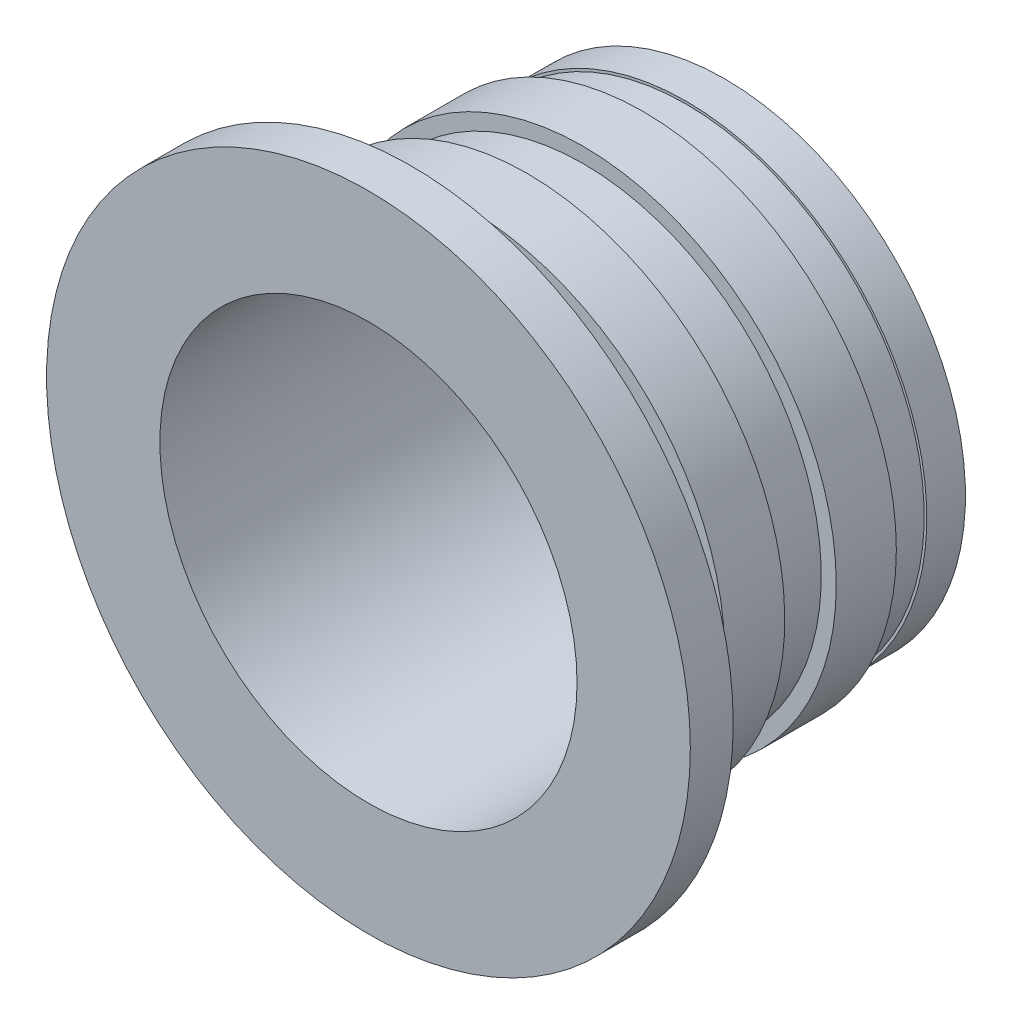
ISO-10303-21;
HEADER;
FILE_DESCRIPTION(('STEP AP214'),'2;1');
FILE_NAME('part.step','',(''),(''),'','','');
FILE_SCHEMA(('AUTOMOTIVE_DESIGN { 1 0 10303 214 1 1 1 1 }'));
ENDSEC;
DATA;
#1=APPLICATION_CONTEXT('core data for automotive mechanical design processes');
#2=APPLICATION_PROTOCOL_DEFINITION('international standard','automotive_design',2000,#1);
#3=PRODUCT_CONTEXT('',#1,'mechanical');
#4=PRODUCT('Part','Part','',(#3));
#5=PRODUCT_RELATED_PRODUCT_CATEGORY('part','',(#4));
#6=PRODUCT_DEFINITION_FORMATION('','',#4);
#7=PRODUCT_DEFINITION_CONTEXT('part definition',#1,'design');
#8=PRODUCT_DEFINITION('design','',#6,#7);
#9=PRODUCT_DEFINITION_SHAPE('','',#8);
#10=(LENGTH_UNIT() NAMED_UNIT(*) SI_UNIT(.MILLI.,.METRE.));
#11=(NAMED_UNIT(*) PLANE_ANGLE_UNIT() SI_UNIT($,.RADIAN.));
#12=(NAMED_UNIT(*) SI_UNIT($,.STERADIAN.) SOLID_ANGLE_UNIT());
#13=UNCERTAINTY_MEASURE_WITH_UNIT(LENGTH_MEASURE(1.E-05),#10,'distance_accuracy_value','');
#14=(GEOMETRIC_REPRESENTATION_CONTEXT(3) GLOBAL_UNCERTAINTY_ASSIGNED_CONTEXT((#13)) GLOBAL_UNIT_ASSIGNED_CONTEXT((#10,
#11,#12)) REPRESENTATION_CONTEXT('',''));
#15=CARTESIAN_POINT('',(0.,0.,0.));
#16=DIRECTION('',(0.,0.,1.));
#17=DIRECTION('',(1.,0.,0.));
#18=AXIS2_PLACEMENT_3D('',#15,#16,#17);
#19=CARTESIAN_POINT('',(0.,0.,1.27));
#20=DIRECTION('',(0.,0.,-1.));
#21=DIRECTION('',(-1.,0.,0.));
#22=AXIS2_PLACEMENT_3D('',#19,#20,#21);
#23=CYLINDRICAL_SURFACE('',#22,9.525);
#24=CARTESIAN_POINT('',(0.,0.,1.27));
#25=DIRECTION('',(0.,0.,1.));
#26=DIRECTION('',(1.,0.,0.));
#27=AXIS2_PLACEMENT_3D('',#24,#25,#26);
#28=CIRCLE('',#27,9.525);
#29=CARTESIAN_POINT('',(9.525,0.,1.27));
#30=VERTEX_POINT('',#29);
#31=EDGE_CURVE('E10',#30,#30,#28,.T.);
#32=ORIENTED_EDGE('',*,*,#31,.F.);
#33=EDGE_LOOP('',(#32));
#34=FACE_BOUND('',#33,.T.);
#35=CARTESIAN_POINT('',(0.,0.,0.));
#36=DIRECTION('',(0.,0.,1.));
#37=DIRECTION('',(1.,0.,0.));
#38=AXIS2_PLACEMENT_3D('',#35,#36,#37);
#39=CIRCLE('',#38,9.525);
#40=CARTESIAN_POINT('',(9.525,0.,0.));
#41=VERTEX_POINT('',#40);
#42=EDGE_CURVE('E35',#41,#41,#39,.T.);
#43=ORIENTED_EDGE('',*,*,#42,.T.);
#44=EDGE_LOOP('',(#43));
#45=FACE_BOUND('',#44,.T.);
#46=ADVANCED_FACE('F32',(#34,#45),#23,.T.);
#47=CARTESIAN_POINT('',(0.,0.,1.27));
#48=DIRECTION('',(0.,0.,1.));
#49=DIRECTION('',(1.,0.,0.));
#50=AXIS2_PLACEMENT_3D('',#47,#48,#49);
#51=PLANE('',#50);
#52=CARTESIAN_POINT('',(0.,0.,1.27));
#53=DIRECTION('',(0.,0.,1.));
#54=DIRECTION('',(1.,0.,0.));
#55=AXIS2_PLACEMENT_3D('',#52,#53,#54);
#56=CIRCLE('',#55,6.1722);
#57=CARTESIAN_POINT('',(6.1722,0.,1.27));
#58=VERTEX_POINT('',#57);
#59=EDGE_CURVE('E44',#58,#58,#56,.T.);
#60=ORIENTED_EDGE('',*,*,#59,.F.);
#61=EDGE_LOOP('',(#60));
#62=FACE_BOUND('',#61,.T.);
#63=ORIENTED_EDGE('',*,*,#31,.T.);
#64=EDGE_LOOP('',(#63));
#65=FACE_BOUND('',#64,.T.);
#66=ADVANCED_FACE('F103',(#62,#65),#51,.T.);
#67=CARTESIAN_POINT('',(0.,0.,0.));
#68=DIRECTION('',(0.,0.,1.));
#69=DIRECTION('',(1.,0.,0.));
#70=AXIS2_PLACEMENT_3D('',#67,#68,#69);
#71=PLANE('',#70);
#72=ORIENTED_EDGE('',*,*,#42,.F.);
#73=EDGE_LOOP('',(#72));
#74=FACE_BOUND('',#73,.T.);
#75=CARTESIAN_POINT('',(0.,0.,0.));
#76=DIRECTION('',(0.,0.,-1.));
#77=DIRECTION('',(0.,1.,0.));
#78=AXIS2_PLACEMENT_3D('',#75,#76,#77);
#79=CIRCLE('',#78,7.1247);
#80=CARTESIAN_POINT('',(0.,7.1247,0.));
#81=VERTEX_POINT('',#80);
#82=EDGE_CURVE('E94',#81,#81,#79,.T.);
#83=ORIENTED_EDGE('',*,*,#82,.F.);
#84=EDGE_LOOP('',(#83));
#85=FACE_BOUND('',#84,.T.);
#86=ADVANCED_FACE('F100',(#74,#85),#71,.F.);
#87=CARTESIAN_POINT('',(0.,0.,-9.271));
#88=DIRECTION('',(0.,0.,1.));
#89=DIRECTION('',(1.,0.,0.));
#90=AXIS2_PLACEMENT_3D('',#87,#88,#89);
#91=PLANE('',#90);
#92=CARTESIAN_POINT('',(0.,0.,-9.271));
#93=DIRECTION('',(0.,0.,-1.));
#94=DIRECTION('',(0.,1.,0.));
#95=AXIS2_PLACEMENT_3D('',#92,#93,#94);
#96=CIRCLE('',#95,7.1247);
#97=CARTESIAN_POINT('',(0.,7.1247,-9.271));
#98=VERTEX_POINT('',#97);
#99=EDGE_CURVE('E91',#98,#98,#96,.T.);
#100=ORIENTED_EDGE('',*,*,#99,.T.);
#101=EDGE_LOOP('',(#100));
#102=FACE_BOUND('',#101,.T.);
#103=CARTESIAN_POINT('',(0.,-3.937,-9.271));
#104=DIRECTION('',(0.,0.,1.));
#105=DIRECTION('',(-1.,0.,0.));
#106=AXIS2_PLACEMENT_3D('',#103,#104,#105);
#107=CIRCLE('',#106,1.27);
#108=CARTESIAN_POINT('',(-1.27,-3.937,-9.271));
#109=VERTEX_POINT('',#108);
#110=EDGE_CURVE('E53',#109,#109,#107,.T.);
#111=ORIENTED_EDGE('',*,*,#110,.T.);
#112=EDGE_LOOP('',(#111));
#113=FACE_BOUND('',#112,.T.);
#114=CARTESIAN_POINT('',(0.,3.937,-9.271));
#115=DIRECTION('',(0.,0.,1.));
#116=DIRECTION('',(1.,0.,0.));
#117=AXIS2_PLACEMENT_3D('',#114,#115,#116);
#118=CIRCLE('',#117,1.27);
#119=CARTESIAN_POINT('',(1.27,3.937,-9.271));
#120=VERTEX_POINT('',#119);
#121=EDGE_CURVE('E47',#120,#120,#118,.T.);
#122=ORIENTED_EDGE('',*,*,#121,.T.);
#123=EDGE_LOOP('',(#122));
#124=FACE_BOUND('',#123,.T.);
#125=ADVANCED_FACE('F102',(#102,#113,#124),#91,.F.);
#126=CARTESIAN_POINT('',(0.,0.,-8.382));
#127=DIRECTION('',(0.,0.,1.));
#128=DIRECTION('',(1.,0.,0.));
#129=AXIS2_PLACEMENT_3D('',#126,#127,#128);
#130=CYLINDRICAL_SURFACE('',#129,6.1722);
#131=CARTESIAN_POINT('',(0.,0.,-8.382));
#132=DIRECTION('',(0.,0.,1.));
#133=DIRECTION('',(1.,0.,0.));
#134=AXIS2_PLACEMENT_3D('',#131,#132,#133);
#135=CIRCLE('',#134,6.1722);
#136=CARTESIAN_POINT('',(6.1722,0.,-8.382));
#137=VERTEX_POINT('',#136);
#138=EDGE_CURVE('E42',#137,#137,#135,.T.);
#139=ORIENTED_EDGE('',*,*,#138,.F.);
#140=EDGE_LOOP('',(#139));
#141=FACE_BOUND('',#140,.T.);
#142=ORIENTED_EDGE('',*,*,#59,.T.);
#143=EDGE_LOOP('',(#142));
#144=FACE_BOUND('',#143,.T.);
#145=ADVANCED_FACE('F109',(#141,#144),#130,.F.);
#146=CARTESIAN_POINT('',(0.,0.,-8.382));
#147=DIRECTION('',(0.,0.,1.));
#148=DIRECTION('',(1.,0.,0.));
#149=AXIS2_PLACEMENT_3D('',#146,#147,#148);
#150=PLANE('',#149);
#151=CARTESIAN_POINT('',(0.,-3.937,-8.382));
#152=DIRECTION('',(0.,0.,1.));
#153=DIRECTION('',(-1.,0.,0.));
#154=AXIS2_PLACEMENT_3D('',#151,#152,#153);
#155=CIRCLE('',#154,1.27);
#156=CARTESIAN_POINT('',(-1.27,-3.937,-8.382));
#157=VERTEX_POINT('',#156);
#158=EDGE_CURVE('E56',#157,#157,#155,.T.);
#159=ORIENTED_EDGE('',*,*,#158,.F.);
#160=EDGE_LOOP('',(#159));
#161=FACE_BOUND('',#160,.T.);
#162=CARTESIAN_POINT('',(0.,3.937,-8.382));
#163=DIRECTION('',(0.,0.,1.));
#164=DIRECTION('',(1.,0.,0.));
#165=AXIS2_PLACEMENT_3D('',#162,#163,#164);
#166=CIRCLE('',#165,1.27);
#167=CARTESIAN_POINT('',(1.27,3.937,-8.382));
#168=VERTEX_POINT('',#167);
#169=EDGE_CURVE('E50',#168,#168,#166,.T.);
#170=ORIENTED_EDGE('',*,*,#169,.F.);
#171=EDGE_LOOP('',(#170));
#172=FACE_BOUND('',#171,.T.);
#173=ORIENTED_EDGE('',*,*,#138,.T.);
#174=EDGE_LOOP('',(#173));
#175=FACE_BOUND('',#174,.T.);
#176=ADVANCED_FACE('F146',(#161,#172,#175),#150,.T.);
#177=CARTESIAN_POINT('',(0.,3.937,-9.271));
#178=DIRECTION('',(0.,0.,1.));
#179=DIRECTION('',(1.,0.,0.));
#180=AXIS2_PLACEMENT_3D('',#177,#178,#179);
#181=CYLINDRICAL_SURFACE('',#180,1.27);
#182=ORIENTED_EDGE('',*,*,#121,.F.);
#183=EDGE_LOOP('',(#182));
#184=FACE_BOUND('',#183,.T.);
#185=ORIENTED_EDGE('',*,*,#169,.T.);
#186=EDGE_LOOP('',(#185));
#187=FACE_BOUND('',#186,.T.);
#188=ADVANCED_FACE('F155',(#184,#187),#181,.F.);
#189=CARTESIAN_POINT('',(0.,-3.937,-9.271));
#190=DIRECTION('',(0.,0.,1.));
#191=DIRECTION('',(1.,0.,0.));
#192=AXIS2_PLACEMENT_3D('',#189,#190,#191);
#193=CYLINDRICAL_SURFACE('',#192,1.27);
#194=ORIENTED_EDGE('',*,*,#110,.F.);
#195=EDGE_LOOP('',(#194));
#196=FACE_BOUND('',#195,.T.);
#197=ORIENTED_EDGE('',*,*,#158,.T.);
#198=EDGE_LOOP('',(#197));
#199=FACE_BOUND('',#198,.T.);
#200=ADVANCED_FACE('F164',(#196,#199),#193,.F.);
#201=CARTESIAN_POINT('',(0.,0.,0.));
#202=DIRECTION('',(0.,0.,-1.));
#203=DIRECTION('',(0.,1.,0.));
#204=AXIS2_PLACEMENT_3D('',#201,#202,#203);
#205=CYLINDRICAL_SURFACE('',#204,7.1247);
#206=CARTESIAN_POINT('',(0.,0.,-1.651));
#207=DIRECTION('',(0.,0.,-1.));
#208=DIRECTION('',(0.,1.,0.));
#209=AXIS2_PLACEMENT_3D('',#206,#207,#208);
#210=CIRCLE('',#209,7.1247);
#211=CARTESIAN_POINT('',(0.,7.1247,-1.651));
#212=VERTEX_POINT('',#211);
#213=EDGE_CURVE('E59',#212,#212,#210,.T.);
#214=ORIENTED_EDGE('',*,*,#213,.F.);
#215=EDGE_LOOP('',(#214));
#216=FACE_BOUND('',#215,.T.);
#217=ORIENTED_EDGE('',*,*,#82,.T.);
#218=EDGE_LOOP('',(#217));
#219=FACE_BOUND('',#218,.T.);
#220=ADVANCED_FACE('F98',(#216,#219),#205,.T.);
#221=CARTESIAN_POINT('',(0.,7.1247,-1.651));
#222=DIRECTION('',(0.,0.,-1.));
#223=DIRECTION('',(0.,1.,0.));
#224=AXIS2_PLACEMENT_3D('',#221,#222,#223);
#225=PLANE('',#224);
#226=CARTESIAN_POINT('',(0.,0.,-1.651));
#227=DIRECTION('',(0.,0.,-1.));
#228=DIRECTION('',(0.,1.,0.));
#229=AXIS2_PLACEMENT_3D('',#226,#227,#228);
#230=CIRCLE('',#229,7.62);
#231=CARTESIAN_POINT('',(0.,7.62,-1.651));
#232=VERTEX_POINT('',#231);
#233=EDGE_CURVE('E64',#232,#232,#230,.T.);
#234=ORIENTED_EDGE('',*,*,#233,.F.);
#235=EDGE_LOOP('',(#234));
#236=FACE_BOUND('',#235,.T.);
#237=ORIENTED_EDGE('',*,*,#213,.T.);
#238=EDGE_LOOP('',(#237));
#239=FACE_BOUND('',#238,.T.);
#240=ADVANCED_FACE('F181',(#236,#239),#225,.F.);
#241=CARTESIAN_POINT('',(0.,0.,0.));
#242=DIRECTION('',(0.,0.,-1.));
#243=DIRECTION('',(0.,1.,0.));
#244=AXIS2_PLACEMENT_3D('',#241,#242,#243);
#245=CYLINDRICAL_SURFACE('',#244,7.62);
#246=CARTESIAN_POINT('',(0.,0.,-3.429));
#247=DIRECTION('',(0.,0.,-1.));
#248=DIRECTION('',(0.,1.,0.));
#249=AXIS2_PLACEMENT_3D('',#246,#247,#248);
#250=CIRCLE('',#249,7.62);
#251=CARTESIAN_POINT('',(0.,7.62,-3.429));
#252=VERTEX_POINT('',#251);
#253=EDGE_CURVE('E67',#252,#252,#250,.T.);
#254=ORIENTED_EDGE('',*,*,#253,.F.);
#255=EDGE_LOOP('',(#254));
#256=FACE_BOUND('',#255,.T.);
#257=ORIENTED_EDGE('',*,*,#233,.T.);
#258=EDGE_LOOP('',(#257));
#259=FACE_BOUND('',#258,.T.);
#260=ADVANCED_FACE('F190',(#256,#259),#245,.T.);
#261=CARTESIAN_POINT('',(0.,7.62,-3.429));
#262=DIRECTION('',(0.,0.,1.));
#263=DIRECTION('',(0.,-1.,0.));
#264=AXIS2_PLACEMENT_3D('',#261,#262,#263);
#265=PLANE('',#264);
#266=CARTESIAN_POINT('',(0.,0.,-3.429));
#267=DIRECTION('',(0.,0.,-1.));
#268=DIRECTION('',(0.,1.,0.));
#269=AXIS2_PLACEMENT_3D('',#266,#267,#268);
#270=CIRCLE('',#269,7.0485);
#271=CARTESIAN_POINT('',(0.,7.0485,-3.429));
#272=VERTEX_POINT('',#271);
#273=EDGE_CURVE('E70',#272,#272,#270,.T.);
#274=ORIENTED_EDGE('',*,*,#273,.F.);
#275=EDGE_LOOP('',(#274));
#276=FACE_BOUND('',#275,.T.);
#277=ORIENTED_EDGE('',*,*,#253,.T.);
#278=EDGE_LOOP('',(#277));
#279=FACE_BOUND('',#278,.T.);
#280=ADVANCED_FACE('F199',(#276,#279),#265,.F.);
#281=CARTESIAN_POINT('',(0.,0.,0.));
#282=DIRECTION('',(0.,0.,-1.));
#283=DIRECTION('',(0.,1.,0.));
#284=AXIS2_PLACEMENT_3D('',#281,#282,#283);
#285=CYLINDRICAL_SURFACE('',#284,7.0485);
#286=CARTESIAN_POINT('',(0.,0.,-5.08));
#287=DIRECTION('',(0.,0.,-1.));
#288=DIRECTION('',(0.,1.,0.));
#289=AXIS2_PLACEMENT_3D('',#286,#287,#288);
#290=CIRCLE('',#289,7.0485);
#291=CARTESIAN_POINT('',(0.,7.0485,-5.08));
#292=VERTEX_POINT('',#291);
#293=EDGE_CURVE('E73',#292,#292,#290,.T.);
#294=ORIENTED_EDGE('',*,*,#293,.F.);
#295=EDGE_LOOP('',(#294));
#296=FACE_BOUND('',#295,.T.);
#297=ORIENTED_EDGE('',*,*,#273,.T.);
#298=EDGE_LOOP('',(#297));
#299=FACE_BOUND('',#298,.T.);
#300=ADVANCED_FACE('F208',(#296,#299),#285,.T.);
#301=CARTESIAN_POINT('',(0.,7.0485,-5.08));
#302=DIRECTION('',(0.,0.,-1.));
#303=DIRECTION('',(0.,1.,0.));
#304=AXIS2_PLACEMENT_3D('',#301,#302,#303);
#305=PLANE('',#304);
#306=CARTESIAN_POINT('',(0.,0.,-5.08));
#307=DIRECTION('',(0.,0.,-1.));
#308=DIRECTION('',(0.,1.,0.));
#309=AXIS2_PLACEMENT_3D('',#306,#307,#308);
#310=CIRCLE('',#309,7.493);
#311=CARTESIAN_POINT('',(0.,7.493,-5.08));
#312=VERTEX_POINT('',#311);
#313=EDGE_CURVE('E76',#312,#312,#310,.T.);
#314=ORIENTED_EDGE('',*,*,#313,.F.);
#315=EDGE_LOOP('',(#314));
#316=FACE_BOUND('',#315,.T.);
#317=ORIENTED_EDGE('',*,*,#293,.T.);
#318=EDGE_LOOP('',(#317));
#319=FACE_BOUND('',#318,.T.);
#320=ADVANCED_FACE('F217',(#316,#319),#305,.F.);
#321=CARTESIAN_POINT('',(0.,0.,0.));
#322=DIRECTION('',(0.,0.,-1.));
#323=DIRECTION('',(0.,1.,0.));
#324=AXIS2_PLACEMENT_3D('',#321,#322,#323);
#325=CYLINDRICAL_SURFACE('',#324,7.493);
#326=CARTESIAN_POINT('',(0.,0.,-6.858));
#327=DIRECTION('',(0.,0.,-1.));
#328=DIRECTION('',(0.,1.,0.));
#329=AXIS2_PLACEMENT_3D('',#326,#327,#328);
#330=CIRCLE('',#329,7.493);
#331=CARTESIAN_POINT('',(0.,7.493,-6.858));
#332=VERTEX_POINT('',#331);
#333=EDGE_CURVE('E79',#332,#332,#330,.T.);
#334=ORIENTED_EDGE('',*,*,#333,.F.);
#335=EDGE_LOOP('',(#334));
#336=FACE_BOUND('',#335,.T.);
#337=ORIENTED_EDGE('',*,*,#313,.T.);
#338=EDGE_LOOP('',(#337));
#339=FACE_BOUND('',#338,.T.);
#340=ADVANCED_FACE('F226',(#336,#339),#325,.T.);
#341=CARTESIAN_POINT('',(0.,7.493,-6.858));
#342=DIRECTION('',(0.,0.,1.));
#343=DIRECTION('',(0.,-1.,0.));
#344=AXIS2_PLACEMENT_3D('',#341,#342,#343);
#345=PLANE('',#344);
#346=CARTESIAN_POINT('',(0.,0.,-6.858));
#347=DIRECTION('',(0.,0.,-1.));
#348=DIRECTION('',(0.,1.,0.));
#349=AXIS2_PLACEMENT_3D('',#346,#347,#348);
#350=CIRCLE('',#349,7.0485);
#351=CARTESIAN_POINT('',(0.,7.0485,-6.858));
#352=VERTEX_POINT('',#351);
#353=EDGE_CURVE('E82',#352,#352,#350,.T.);
#354=ORIENTED_EDGE('',*,*,#353,.F.);
#355=EDGE_LOOP('',(#354));
#356=FACE_BOUND('',#355,.T.);
#357=ORIENTED_EDGE('',*,*,#333,.T.);
#358=EDGE_LOOP('',(#357));
#359=FACE_BOUND('',#358,.T.);
#360=ADVANCED_FACE('F235',(#356,#359),#345,.F.);
#361=CARTESIAN_POINT('',(0.,0.,0.));
#362=DIRECTION('',(0.,0.,-1.));
#363=DIRECTION('',(0.,1.,0.));
#364=AXIS2_PLACEMENT_3D('',#361,#362,#363);
#365=CYLINDRICAL_SURFACE('',#364,7.0485);
#366=CARTESIAN_POINT('',(0.,0.,-8.128));
#367=DIRECTION('',(0.,0.,-1.));
#368=DIRECTION('',(0.,1.,0.));
#369=AXIS2_PLACEMENT_3D('',#366,#367,#368);
#370=CIRCLE('',#369,7.0485);
#371=CARTESIAN_POINT('',(0.,7.0485,-8.128));
#372=VERTEX_POINT('',#371);
#373=EDGE_CURVE('E85',#372,#372,#370,.T.);
#374=ORIENTED_EDGE('',*,*,#373,.F.);
#375=EDGE_LOOP('',(#374));
#376=FACE_BOUND('',#375,.T.);
#377=ORIENTED_EDGE('',*,*,#353,.T.);
#378=EDGE_LOOP('',(#377));
#379=FACE_BOUND('',#378,.T.);
#380=ADVANCED_FACE('F244',(#376,#379),#365,.T.);
#381=CARTESIAN_POINT('',(0.,7.0485,-8.128));
#382=DIRECTION('',(0.,0.,-1.));
#383=DIRECTION('',(0.,1.,0.));
#384=AXIS2_PLACEMENT_3D('',#381,#382,#383);
#385=PLANE('',#384);
#386=CARTESIAN_POINT('',(0.,0.,-8.128));
#387=DIRECTION('',(0.,0.,-1.));
#388=DIRECTION('',(0.,1.,0.));
#389=AXIS2_PLACEMENT_3D('',#386,#387,#388);
#390=CIRCLE('',#389,7.1247);
#391=CARTESIAN_POINT('',(0.,7.1247,-8.128));
#392=VERTEX_POINT('',#391);
#393=EDGE_CURVE('E88',#392,#392,#390,.T.);
#394=ORIENTED_EDGE('',*,*,#393,.F.);
#395=EDGE_LOOP('',(#394));
#396=FACE_BOUND('',#395,.T.);
#397=ORIENTED_EDGE('',*,*,#373,.T.);
#398=EDGE_LOOP('',(#397));
#399=FACE_BOUND('',#398,.T.);
#400=ADVANCED_FACE('F253',(#396,#399),#385,.F.);
#401=CARTESIAN_POINT('',(0.,0.,0.));
#402=DIRECTION('',(0.,0.,-1.));
#403=DIRECTION('',(0.,1.,0.));
#404=AXIS2_PLACEMENT_3D('',#401,#402,#403);
#405=CYLINDRICAL_SURFACE('',#404,7.1247);
#406=ORIENTED_EDGE('',*,*,#99,.F.);
#407=EDGE_LOOP('',(#406));
#408=FACE_BOUND('',#407,.T.);
#409=ORIENTED_EDGE('',*,*,#393,.T.);
#410=EDGE_LOOP('',(#409));
#411=FACE_BOUND('',#410,.T.);
#412=ADVANCED_FACE('F262',(#408,#411),#405,.T.);
#413=CLOSED_SHELL('',(#46,#66,#86,#125,#145,#176,#188,#200,#220,#240,#260,#280,#300,#320,#340,
#360,#380,#400,#412));
#414=MANIFOLD_SOLID_BREP('B2',#413);
#415=ADVANCED_BREP_SHAPE_REPRESENTATION('',(#18,#414),#14);
#416=SHAPE_DEFINITION_REPRESENTATION(#9,#415);
ENDSEC;
END-ISO-10303-21;
